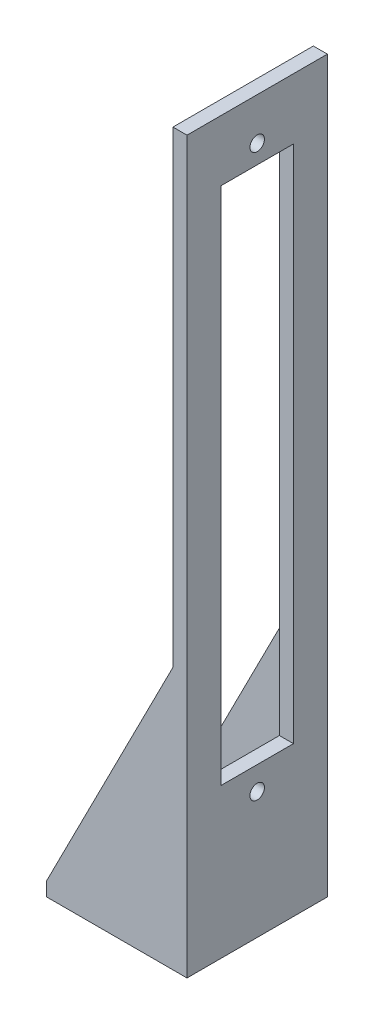
ISO-10303-21;
HEADER;
FILE_DESCRIPTION(('STEP AP214'),'2;1');
FILE_NAME('part.step','',(''),(''),'','','');
FILE_SCHEMA(('AUTOMOTIVE_DESIGN { 1 0 10303 214 1 1 1 1 }'));
ENDSEC;
DATA;
#1=APPLICATION_CONTEXT('core data for automotive mechanical design processes');
#2=APPLICATION_PROTOCOL_DEFINITION('international standard','automotive_design',2000,#1);
#3=PRODUCT_CONTEXT('',#1,'mechanical');
#4=PRODUCT('Part','Part','',(#3));
#5=PRODUCT_RELATED_PRODUCT_CATEGORY('part','',(#4));
#6=PRODUCT_DEFINITION_FORMATION('','',#4);
#7=PRODUCT_DEFINITION_CONTEXT('part definition',#1,'design');
#8=PRODUCT_DEFINITION('design','',#6,#7);
#9=PRODUCT_DEFINITION_SHAPE('','',#8);
#10=(LENGTH_UNIT() NAMED_UNIT(*) SI_UNIT(.MILLI.,.METRE.));
#11=(NAMED_UNIT(*) PLANE_ANGLE_UNIT() SI_UNIT($,.RADIAN.));
#12=(NAMED_UNIT(*) SI_UNIT($,.STERADIAN.) SOLID_ANGLE_UNIT());
#13=UNCERTAINTY_MEASURE_WITH_UNIT(LENGTH_MEASURE(1.E-05),#10,'distance_accuracy_value','');
#14=(GEOMETRIC_REPRESENTATION_CONTEXT(3) GLOBAL_UNCERTAINTY_ASSIGNED_CONTEXT((#13)) GLOBAL_UNIT_ASSIGNED_CONTEXT((#10,
#11,#12)) REPRESENTATION_CONTEXT('',''));
#15=CARTESIAN_POINT('',(0.,0.,0.));
#16=DIRECTION('',(0.,0.,1.));
#17=DIRECTION('',(1.,0.,0.));
#18=AXIS2_PLACEMENT_3D('',#15,#16,#17);
#19=CARTESIAN_POINT('',(0.,3.,0.));
#20=DIRECTION('',(0.,-1.,0.));
#21=DIRECTION('',(0.,0.,-1.));
#22=AXIS2_PLACEMENT_3D('',#19,#20,#21);
#23=PLANE('',#22);
#24=CARTESIAN_POINT('',(7.,3.,-9.));
#25=DIRECTION('',(0.,1.,0.));
#26=DIRECTION('',(0.,0.,1.));
#27=AXIS2_PLACEMENT_3D('',#24,#25,#26);
#28=CIRCLE('',#27,1.55);
#29=CARTESIAN_POINT('',(7.,3.,-7.45));
#30=VERTEX_POINT('',#29);
#31=EDGE_CURVE('E239',#30,#30,#28,.T.);
#32=ORIENTED_EDGE('',*,*,#31,.F.);
#33=EDGE_LOOP('',(#32));
#34=FACE_BOUND('',#33,.T.);
#35=CARTESIAN_POINT('',(-9.,3.,7.));
#36=DIRECTION('',(0.,1.,0.));
#37=DIRECTION('',(0.,0.,1.));
#38=AXIS2_PLACEMENT_3D('',#35,#36,#37);
#39=CIRCLE('',#38,1.55);
#40=CARTESIAN_POINT('',(-9.,3.,8.55));
#41=VERTEX_POINT('',#40);
#42=EDGE_CURVE('E247',#41,#41,#39,.T.);
#43=ORIENTED_EDGE('',*,*,#42,.F.);
#44=EDGE_LOOP('',(#43));
#45=FACE_BOUND('',#44,.T.);
#46=DIRECTION('',(0.,0.,1.));
#47=VECTOR('',#46,1.);
#48=CARTESIAN_POINT('',(12.,3.,-15.));
#49=LINE('',#48,#47);
#50=CARTESIAN_POINT('',(12.,3.,-12.));
#51=VERTEX_POINT('',#50);
#52=CARTESIAN_POINT('',(12.,3.,12.));
#53=VERTEX_POINT('',#52);
#54=EDGE_CURVE('E167',#51,#53,#49,.T.);
#55=ORIENTED_EDGE('',*,*,#54,.F.);
#56=DIRECTION('',(-1.,0.,0.));
#57=VECTOR('',#56,1.);
#58=CARTESIAN_POINT('',(12.,3.,-12.));
#59=LINE('',#58,#57);
#60=CARTESIAN_POINT('',(-15.,3.,-12.));
#61=VERTEX_POINT('',#60);
#62=EDGE_CURVE('E63',#51,#61,#59,.T.);
#63=ORIENTED_EDGE('',*,*,#62,.T.);
#64=DIRECTION('',(0.,0.,1.));
#65=VECTOR('',#64,1.);
#66=CARTESIAN_POINT('',(-15.,3.,15.));
#67=LINE('',#66,#65);
#68=CARTESIAN_POINT('',(-15.,3.,12.));
#69=VERTEX_POINT('',#68);
#70=EDGE_CURVE('E260',#61,#69,#67,.T.);
#71=ORIENTED_EDGE('',*,*,#70,.T.);
#72=DIRECTION('',(1.,0.,0.));
#73=VECTOR('',#72,1.);
#74=CARTESIAN_POINT('',(-15.,3.,12.));
#75=LINE('',#74,#73);
#76=EDGE_CURVE('E156',#69,#53,#75,.T.);
#77=ORIENTED_EDGE('',*,*,#76,.T.);
#78=EDGE_LOOP('',(#55,#63,#71,#77));
#79=FACE_BOUND('',#78,.T.);
#80=ADVANCED_FACE('F45',(#34,#45,#79),#23,.F.);
#81=CARTESIAN_POINT('',(0.,0.,0.));
#82=DIRECTION('',(0.,-1.,0.));
#83=DIRECTION('',(0.,0.,-1.));
#84=AXIS2_PLACEMENT_3D('',#81,#82,#83);
#85=PLANE('',#84);
#86=CARTESIAN_POINT('',(-9.,0.,7.));
#87=DIRECTION('',(0.,1.,0.));
#88=DIRECTION('',(0.,0.,1.));
#89=AXIS2_PLACEMENT_3D('',#86,#87,#88);
#90=CIRCLE('',#89,1.55);
#91=CARTESIAN_POINT('',(-9.,0.,8.55));
#92=VERTEX_POINT('',#91);
#93=EDGE_CURVE('E243',#92,#92,#90,.T.);
#94=ORIENTED_EDGE('',*,*,#93,.T.);
#95=EDGE_LOOP('',(#94));
#96=FACE_BOUND('',#95,.T.);
#97=DIRECTION('',(0.,0.,-1.));
#98=VECTOR('',#97,1.);
#99=CARTESIAN_POINT('',(15.,0.,15.));
#100=LINE('',#99,#98);
#101=CARTESIAN_POINT('',(15.,0.,15.));
#102=VERTEX_POINT('',#101);
#103=CARTESIAN_POINT('',(15.,0.,-15.));
#104=VERTEX_POINT('',#103);
#105=EDGE_CURVE('E251',#102,#104,#100,.T.);
#106=ORIENTED_EDGE('',*,*,#105,.F.);
#107=DIRECTION('',(1.,0.,0.));
#108=VECTOR('',#107,1.);
#109=CARTESIAN_POINT('',(-15.,0.,15.));
#110=LINE('',#109,#108);
#111=CARTESIAN_POINT('',(-15.,0.,15.));
#112=VERTEX_POINT('',#111);
#113=EDGE_CURVE('E270',#112,#102,#110,.T.);
#114=ORIENTED_EDGE('',*,*,#113,.F.);
#115=DIRECTION('',(0.,0.,1.));
#116=VECTOR('',#115,1.);
#117=CARTESIAN_POINT('',(-15.,0.,15.));
#118=LINE('',#117,#116);
#119=CARTESIAN_POINT('',(-15.,0.,-15.));
#120=VERTEX_POINT('',#119);
#121=EDGE_CURVE('E267',#120,#112,#118,.T.);
#122=ORIENTED_EDGE('',*,*,#121,.F.);
#123=DIRECTION('',(-1.,0.,0.));
#124=VECTOR('',#123,1.);
#125=CARTESIAN_POINT('',(-15.,0.,-15.));
#126=LINE('',#125,#124);
#127=EDGE_CURVE('E264',#104,#120,#126,.T.);
#128=ORIENTED_EDGE('',*,*,#127,.F.);
#129=EDGE_LOOP('',(#106,#114,#122,#128));
#130=FACE_BOUND('',#129,.T.);
#131=CARTESIAN_POINT('',(7.,0.,-9.));
#132=DIRECTION('',(0.,1.,0.));
#133=DIRECTION('',(0.,0.,1.));
#134=AXIS2_PLACEMENT_3D('',#131,#132,#133);
#135=CIRCLE('',#134,1.55);
#136=CARTESIAN_POINT('',(7.,0.,-7.45));
#137=VERTEX_POINT('',#136);
#138=EDGE_CURVE('E238',#137,#137,#135,.T.);
#139=ORIENTED_EDGE('',*,*,#138,.T.);
#140=EDGE_LOOP('',(#139));
#141=FACE_BOUND('',#140,.T.);
#142=ADVANCED_FACE('F322',(#96,#130,#141),#85,.T.);
#143=CARTESIAN_POINT('',(15.,3.,15.));
#144=DIRECTION('',(-1.,0.,0.));
#145=DIRECTION('',(0.,0.,1.));
#146=AXIS2_PLACEMENT_3D('',#143,#144,#145);
#147=PLANE('',#146);
#148=CARTESIAN_POINT('',(15.,147.,0.));
#149=DIRECTION('',(1.,0.,0.));
#150=DIRECTION('',(0.,0.,-1.));
#151=AXIS2_PLACEMENT_3D('',#148,#149,#150);
#152=CIRCLE('',#151,1.54999999999999);
#153=CARTESIAN_POINT('',(15.,147.,-1.54999999999999));
#154=VERTEX_POINT('',#153);
#155=EDGE_CURVE('E180',#154,#154,#152,.T.);
#156=ORIENTED_EDGE('',*,*,#155,.F.);
#157=EDGE_LOOP('',(#156));
#158=FACE_BOUND('',#157,.T.);
#159=CARTESIAN_POINT('',(15.,27.,0.));
#160=DIRECTION('',(1.,0.,0.));
#161=DIRECTION('',(0.,0.,-1.));
#162=AXIS2_PLACEMENT_3D('',#159,#160,#161);
#163=CIRCLE('',#162,1.55);
#164=CARTESIAN_POINT('',(15.,27.,-1.55));
#165=VERTEX_POINT('',#164);
#166=EDGE_CURVE('E185',#165,#165,#163,.T.);
#167=ORIENTED_EDGE('',*,*,#166,.F.);
#168=EDGE_LOOP('',(#167));
#169=FACE_BOUND('',#168,.T.);
#170=DIRECTION('',(0.,0.,1.));
#171=VECTOR('',#170,1.);
#172=CARTESIAN_POINT('',(15.,143.,7.75));
#173=LINE('',#172,#171);
#174=CARTESIAN_POINT('',(15.,143.,-7.75));
#175=VERTEX_POINT('',#174);
#176=CARTESIAN_POINT('',(15.,143.,7.75));
#177=VERTEX_POINT('',#176);
#178=EDGE_CURVE('E210',#175,#177,#173,.T.);
#179=ORIENTED_EDGE('',*,*,#178,.F.);
#180=DIRECTION('',(0.,1.,0.));
#181=VECTOR('',#180,1.);
#182=CARTESIAN_POINT('',(15.,32.,-7.75));
#183=LINE('',#182,#181);
#184=CARTESIAN_POINT('',(15.,32.,-7.75));
#185=VERTEX_POINT('',#184);
#186=EDGE_CURVE('E189',#185,#175,#183,.T.);
#187=ORIENTED_EDGE('',*,*,#186,.F.);
#188=DIRECTION('',(0.,0.,-1.));
#189=VECTOR('',#188,1.);
#190=CARTESIAN_POINT('',(15.,32.,7.75));
#191=LINE('',#190,#189);
#192=CARTESIAN_POINT('',(15.,32.,7.75));
#193=VERTEX_POINT('',#192);
#194=EDGE_CURVE('E194',#193,#185,#191,.T.);
#195=ORIENTED_EDGE('',*,*,#194,.F.);
#196=DIRECTION('',(0.,-1.,0.));
#197=VECTOR('',#196,1.);
#198=CARTESIAN_POINT('',(15.,32.,7.75));
#199=LINE('',#198,#197);
#200=EDGE_CURVE('E206',#177,#193,#199,.T.);
#201=ORIENTED_EDGE('',*,*,#200,.F.);
#202=EDGE_LOOP('',(#179,#187,#195,#201));
#203=FACE_BOUND('',#202,.T.);
#204=ORIENTED_EDGE('',*,*,#105,.T.);
#205=DIRECTION('',(0.,-1.,0.));
#206=VECTOR('',#205,1.);
#207=CARTESIAN_POINT('',(15.,3.,-15.));
#208=LINE('',#207,#206);
#209=CARTESIAN_POINT('',(15.,156.,-15.));
#210=VERTEX_POINT('',#209);
#211=EDGE_CURVE('E284',#210,#104,#208,.T.);
#212=ORIENTED_EDGE('',*,*,#211,.F.);
#213=DIRECTION('',(0.,0.,-1.));
#214=VECTOR('',#213,1.);
#215=CARTESIAN_POINT('',(15.,156.,-15.));
#216=LINE('',#215,#214);
#217=CARTESIAN_POINT('',(15.,156.,15.));
#218=VERTEX_POINT('',#217);
#219=EDGE_CURVE('E216',#218,#210,#216,.T.);
#220=ORIENTED_EDGE('',*,*,#219,.F.);
#221=DIRECTION('',(0.,-1.,0.));
#222=VECTOR('',#221,1.);
#223=CARTESIAN_POINT('',(15.,3.,15.));
#224=LINE('',#223,#222);
#225=EDGE_CURVE('E259',#218,#102,#224,.T.);
#226=ORIENTED_EDGE('',*,*,#225,.T.);
#227=EDGE_LOOP('',(#204,#212,#220,#226));
#228=FACE_BOUND('',#227,.T.);
#229=ADVANCED_FACE('F47',(#158,#169,#203,#228),#147,.F.);
#230=CARTESIAN_POINT('',(-15.,3.,-15.));
#231=DIRECTION('',(0.,0.,1.));
#232=DIRECTION('',(1.,0.,0.));
#233=AXIS2_PLACEMENT_3D('',#230,#231,#232);
#234=PLANE('',#233);
#235=DIRECTION('',(0.,-1.,0.));
#236=VECTOR('',#235,1.);
#237=CARTESIAN_POINT('',(-15.,3.,-15.));
#238=LINE('',#237,#236);
#239=CARTESIAN_POINT('',(-15.,3.,-15.));
#240=VERTEX_POINT('',#239);
#241=EDGE_CURVE('E280',#240,#120,#238,.T.);
#242=ORIENTED_EDGE('',*,*,#241,.F.);
#243=DIRECTION('',(0.453925781418884,0.89103949685929,0.));
#244=VECTOR('',#243,1.);
#245=CARTESIAN_POINT('',(-15.,3.,-15.));
#246=LINE('',#245,#244);
#247=CARTESIAN_POINT('',(12.,56.,-15.));
#248=VERTEX_POINT('',#247);
#249=EDGE_CURVE('E354',#240,#248,#246,.T.);
#250=ORIENTED_EDGE('',*,*,#249,.T.);
#251=DIRECTION('',(0.,-1.,0.));
#252=VECTOR('',#251,1.);
#253=CARTESIAN_POINT('',(12.,156.,-15.));
#254=LINE('',#253,#252);
#255=CARTESIAN_POINT('',(12.,156.,-15.));
#256=VERTEX_POINT('',#255);
#257=EDGE_CURVE('E235',#256,#248,#254,.T.);
#258=ORIENTED_EDGE('',*,*,#257,.F.);
#259=DIRECTION('',(-1.,0.,0.));
#260=VECTOR('',#259,1.);
#261=CARTESIAN_POINT('',(15.,156.,-15.));
#262=LINE('',#261,#260);
#263=EDGE_CURVE('E220',#210,#256,#262,.T.);
#264=ORIENTED_EDGE('',*,*,#263,.F.);
#265=ORIENTED_EDGE('',*,*,#211,.T.);
#266=ORIENTED_EDGE('',*,*,#127,.T.);
#267=EDGE_LOOP('',(#242,#250,#258,#264,#265,#266));
#268=FACE_BOUND('',#267,.T.);
#269=ADVANCED_FACE('F343',(#268),#234,.F.);
#270=CARTESIAN_POINT('',(-15.,3.,15.));
#271=DIRECTION('',(1.,0.,0.));
#272=DIRECTION('',(0.,0.,-1.));
#273=AXIS2_PLACEMENT_3D('',#270,#271,#272);
#274=PLANE('',#273);
#275=ORIENTED_EDGE('',*,*,#121,.T.);
#276=DIRECTION('',(0.,-1.,0.));
#277=VECTOR('',#276,1.);
#278=CARTESIAN_POINT('',(-15.,3.,15.));
#279=LINE('',#278,#277);
#280=CARTESIAN_POINT('',(-15.,3.,15.));
#281=VERTEX_POINT('',#280);
#282=EDGE_CURVE('E276',#281,#112,#279,.T.);
#283=ORIENTED_EDGE('',*,*,#282,.F.);
#284=DIRECTION('',(0.,0.,1.));
#285=VECTOR('',#284,1.);
#286=CARTESIAN_POINT('',(-15.,3.,12.));
#287=LINE('',#286,#285);
#288=EDGE_CURVE('E155',#69,#281,#287,.T.);
#289=ORIENTED_EDGE('',*,*,#288,.F.);
#290=ORIENTED_EDGE('',*,*,#70,.F.);
#291=EDGE_CURVE('E255',#240,#61,#67,.T.);
#292=ORIENTED_EDGE('',*,*,#291,.F.);
#293=ORIENTED_EDGE('',*,*,#241,.T.);
#294=EDGE_LOOP('',(#275,#283,#289,#290,#292,#293));
#295=FACE_BOUND('',#294,.T.);
#296=ADVANCED_FACE('F340',(#295),#274,.F.);
#297=CARTESIAN_POINT('',(-15.,3.,15.));
#298=DIRECTION('',(0.,0.,-1.));
#299=DIRECTION('',(-1.,0.,0.));
#300=AXIS2_PLACEMENT_3D('',#297,#298,#299);
#301=PLANE('',#300);
#302=ORIENTED_EDGE('',*,*,#113,.T.);
#303=ORIENTED_EDGE('',*,*,#225,.F.);
#304=DIRECTION('',(1.,0.,0.));
#305=VECTOR('',#304,1.);
#306=CARTESIAN_POINT('',(15.,156.,15.));
#307=LINE('',#306,#305);
#308=CARTESIAN_POINT('',(12.,156.,15.));
#309=VERTEX_POINT('',#308);
#310=EDGE_CURVE('E226',#309,#218,#307,.T.);
#311=ORIENTED_EDGE('',*,*,#310,.F.);
#312=DIRECTION('',(0.,-1.,0.));
#313=VECTOR('',#312,1.);
#314=CARTESIAN_POINT('',(12.,156.,15.));
#315=LINE('',#314,#313);
#316=CARTESIAN_POINT('',(12.,56.,15.));
#317=VERTEX_POINT('',#316);
#318=EDGE_CURVE('E230',#309,#317,#315,.T.);
#319=ORIENTED_EDGE('',*,*,#318,.T.);
#320=DIRECTION('',(-0.453925781418884,-0.89103949685929,0.));
#321=VECTOR('',#320,1.);
#322=CARTESIAN_POINT('',(12.,56.,15.));
#323=LINE('',#322,#321);
#324=EDGE_CURVE('E150',#317,#281,#323,.T.);
#325=ORIENTED_EDGE('',*,*,#324,.T.);
#326=ORIENTED_EDGE('',*,*,#282,.T.);
#327=EDGE_LOOP('',(#302,#303,#311,#319,#325,#326));
#328=FACE_BOUND('',#327,.T.);
#329=ADVANCED_FACE('F338',(#328),#301,.F.);
#330=CARTESIAN_POINT('',(-9.,3.,7.));
#331=DIRECTION('',(0.,-1.,0.));
#332=DIRECTION('',(0.,0.,-1.));
#333=AXIS2_PLACEMENT_3D('',#330,#331,#332);
#334=CYLINDRICAL_SURFACE('',#333,1.55);
#335=ORIENTED_EDGE('',*,*,#42,.T.);
#336=EDGE_LOOP('',(#335));
#337=FACE_BOUND('',#336,.T.);
#338=ORIENTED_EDGE('',*,*,#93,.F.);
#339=EDGE_LOOP('',(#338));
#340=FACE_BOUND('',#339,.T.);
#341=ADVANCED_FACE('F335',(#337,#340),#334,.F.);
#342=CARTESIAN_POINT('',(7.,3.,-9.));
#343=DIRECTION('',(0.,-1.,0.));
#344=DIRECTION('',(0.,0.,-1.));
#345=AXIS2_PLACEMENT_3D('',#342,#343,#344);
#346=CYLINDRICAL_SURFACE('',#345,1.55);
#347=ORIENTED_EDGE('',*,*,#31,.T.);
#348=EDGE_LOOP('',(#347));
#349=FACE_BOUND('',#348,.T.);
#350=ORIENTED_EDGE('',*,*,#138,.F.);
#351=EDGE_LOOP('',(#350));
#352=FACE_BOUND('',#351,.T.);
#353=ADVANCED_FACE('F463',(#349,#352),#346,.F.);
#354=CARTESIAN_POINT('',(12.,156.,-15.));
#355=DIRECTION('',(1.,0.,0.));
#356=DIRECTION('',(0.,0.,-1.));
#357=AXIS2_PLACEMENT_3D('',#354,#355,#356);
#358=PLANE('',#357);
#359=CARTESIAN_POINT('',(12.,147.,0.));
#360=DIRECTION('',(1.,0.,0.));
#361=DIRECTION('',(0.,0.,-1.));
#362=AXIS2_PLACEMENT_3D('',#359,#360,#361);
#363=CIRCLE('',#362,1.54999999999999);
#364=CARTESIAN_POINT('',(12.,147.,-1.54999999999999));
#365=VERTEX_POINT('',#364);
#366=EDGE_CURVE('E49',#365,#365,#363,.T.);
#367=ORIENTED_EDGE('',*,*,#366,.T.);
#368=EDGE_LOOP('',(#367));
#369=FACE_BOUND('',#368,.T.);
#370=CARTESIAN_POINT('',(12.,27.,0.));
#371=DIRECTION('',(1.,0.,0.));
#372=DIRECTION('',(0.,0.,-1.));
#373=AXIS2_PLACEMENT_3D('',#370,#371,#372);
#374=CIRCLE('',#373,1.55);
#375=CARTESIAN_POINT('',(12.,27.,-1.55));
#376=VERTEX_POINT('',#375);
#377=EDGE_CURVE('E184',#376,#376,#374,.T.);
#378=ORIENTED_EDGE('',*,*,#377,.T.);
#379=EDGE_LOOP('',(#378));
#380=FACE_BOUND('',#379,.T.);
#381=DIRECTION('',(0.,0.,-1.));
#382=VECTOR('',#381,1.);
#383=CARTESIAN_POINT('',(12.,32.,-15.));
#384=LINE('',#383,#382);
#385=CARTESIAN_POINT('',(12.,32.,7.75));
#386=VERTEX_POINT('',#385);
#387=CARTESIAN_POINT('',(12.,32.,-7.75));
#388=VERTEX_POINT('',#387);
#389=EDGE_CURVE('E55',#386,#388,#384,.T.);
#390=ORIENTED_EDGE('',*,*,#389,.T.);
#391=DIRECTION('',(0.,1.,0.));
#392=VECTOR('',#391,1.);
#393=CARTESIAN_POINT('',(12.,156.,-7.75));
#394=LINE('',#393,#392);
#395=CARTESIAN_POINT('',(12.,143.,-7.75));
#396=VERTEX_POINT('',#395);
#397=EDGE_CURVE('E11',#388,#396,#394,.T.);
#398=ORIENTED_EDGE('',*,*,#397,.T.);
#399=DIRECTION('',(0.,0.,1.));
#400=VECTOR('',#399,1.);
#401=CARTESIAN_POINT('',(12.,143.,-15.));
#402=LINE('',#401,#400);
#403=CARTESIAN_POINT('',(12.,143.,7.75));
#404=VERTEX_POINT('',#403);
#405=EDGE_CURVE('E288',#396,#404,#402,.T.);
#406=ORIENTED_EDGE('',*,*,#405,.T.);
#407=DIRECTION('',(0.,-1.,0.));
#408=VECTOR('',#407,1.);
#409=CARTESIAN_POINT('',(12.,156.,7.75));
#410=LINE('',#409,#408);
#411=EDGE_CURVE('E292',#404,#386,#410,.T.);
#412=ORIENTED_EDGE('',*,*,#411,.T.);
#413=EDGE_LOOP('',(#390,#398,#406,#412));
#414=FACE_BOUND('',#413,.T.);
#415=ORIENTED_EDGE('',*,*,#257,.T.);
#416=DIRECTION('',(0.,0.,-1.));
#417=VECTOR('',#416,1.);
#418=CARTESIAN_POINT('',(12.,56.,-12.));
#419=LINE('',#418,#417);
#420=CARTESIAN_POINT('',(12.,56.,-12.));
#421=VERTEX_POINT('',#420);
#422=EDGE_CURVE('E71',#421,#248,#419,.T.);
#423=ORIENTED_EDGE('',*,*,#422,.F.);
#424=DIRECTION('',(0.,-1.,0.));
#425=VECTOR('',#424,1.);
#426=CARTESIAN_POINT('',(12.,56.,-12.));
#427=LINE('',#426,#425);
#428=EDGE_CURVE('E364',#421,#51,#427,.T.);
#429=ORIENTED_EDGE('',*,*,#428,.T.);
#430=ORIENTED_EDGE('',*,*,#54,.T.);
#431=DIRECTION('',(0.,1.,0.));
#432=VECTOR('',#431,1.);
#433=CARTESIAN_POINT('',(12.,3.,12.));
#434=LINE('',#433,#432);
#435=CARTESIAN_POINT('',(12.,56.,12.));
#436=VERTEX_POINT('',#435);
#437=EDGE_CURVE('E161',#53,#436,#434,.T.);
#438=ORIENTED_EDGE('',*,*,#437,.T.);
#439=DIRECTION('',(0.,0.,1.));
#440=VECTOR('',#439,1.);
#441=CARTESIAN_POINT('',(12.,56.,12.));
#442=LINE('',#441,#440);
#443=EDGE_CURVE('E144',#436,#317,#442,.T.);
#444=ORIENTED_EDGE('',*,*,#443,.T.);
#445=ORIENTED_EDGE('',*,*,#318,.F.);
#446=DIRECTION('',(0.,0.,1.));
#447=VECTOR('',#446,1.);
#448=CARTESIAN_POINT('',(12.,156.,-15.));
#449=LINE('',#448,#447);
#450=EDGE_CURVE('E223',#256,#309,#449,.T.);
#451=ORIENTED_EDGE('',*,*,#450,.F.);
#452=EDGE_LOOP('',(#415,#423,#429,#430,#438,#444,#445,#451));
#453=FACE_BOUND('',#452,.T.);
#454=ADVANCED_FACE('F166',(#369,#380,#414,#453),#358,.F.);
#455=CARTESIAN_POINT('',(0.,156.,0.));
#456=DIRECTION('',(0.,-1.,0.));
#457=DIRECTION('',(0.,0.,-1.));
#458=AXIS2_PLACEMENT_3D('',#455,#456,#457);
#459=PLANE('',#458);
#460=ORIENTED_EDGE('',*,*,#219,.T.);
#461=ORIENTED_EDGE('',*,*,#263,.T.);
#462=ORIENTED_EDGE('',*,*,#450,.T.);
#463=ORIENTED_EDGE('',*,*,#310,.T.);
#464=EDGE_LOOP('',(#460,#461,#462,#463));
#465=FACE_BOUND('',#464,.T.);
#466=ADVANCED_FACE('F445',(#465),#459,.F.);
#467=CARTESIAN_POINT('',(-138.,32.,-7.75));
#468=DIRECTION('',(0.,0.,-1.));
#469=DIRECTION('',(-1.,0.,0.));
#470=AXIS2_PLACEMENT_3D('',#467,#468,#469);
#471=PLANE('',#470);
#472=DIRECTION('',(1.,0.,0.));
#473=VECTOR('',#472,1.);
#474=CARTESIAN_POINT('',(-138.,32.,-7.75));
#475=LINE('',#474,#473);
#476=EDGE_CURVE('E178',#388,#185,#475,.T.);
#477=ORIENTED_EDGE('',*,*,#476,.T.);
#478=ORIENTED_EDGE('',*,*,#186,.T.);
#479=DIRECTION('',(1.,0.,0.));
#480=VECTOR('',#479,1.);
#481=CARTESIAN_POINT('',(-138.,143.,-7.75));
#482=LINE('',#481,#480);
#483=EDGE_CURVE('E190',#396,#175,#482,.T.);
#484=ORIENTED_EDGE('',*,*,#483,.F.);
#485=ORIENTED_EDGE('',*,*,#397,.F.);
#486=EDGE_LOOP('',(#477,#478,#484,#485));
#487=FACE_BOUND('',#486,.T.);
#488=ADVANCED_FACE('F435',(#487),#471,.F.);
#489=CARTESIAN_POINT('',(-138.,32.,7.75));
#490=DIRECTION('',(0.,-1.,0.));
#491=DIRECTION('',(0.,0.,-1.));
#492=AXIS2_PLACEMENT_3D('',#489,#490,#491);
#493=PLANE('',#492);
#494=DIRECTION('',(1.,0.,0.));
#495=VECTOR('',#494,1.);
#496=CARTESIAN_POINT('',(-138.,32.,7.75));
#497=LINE('',#496,#495);
#498=EDGE_CURVE('E198',#386,#193,#497,.T.);
#499=ORIENTED_EDGE('',*,*,#498,.T.);
#500=ORIENTED_EDGE('',*,*,#194,.T.);
#501=ORIENTED_EDGE('',*,*,#476,.F.);
#502=ORIENTED_EDGE('',*,*,#389,.F.);
#503=EDGE_LOOP('',(#499,#500,#501,#502));
#504=FACE_BOUND('',#503,.T.);
#505=ADVANCED_FACE('F425',(#504),#493,.F.);
#506=CARTESIAN_POINT('',(-138.,32.,7.75));
#507=DIRECTION('',(0.,0.,1.));
#508=DIRECTION('',(1.,0.,0.));
#509=AXIS2_PLACEMENT_3D('',#506,#507,#508);
#510=PLANE('',#509);
#511=DIRECTION('',(1.,0.,0.));
#512=VECTOR('',#511,1.);
#513=CARTESIAN_POINT('',(-138.,143.,7.75));
#514=LINE('',#513,#512);
#515=EDGE_CURVE('E195',#404,#177,#514,.T.);
#516=ORIENTED_EDGE('',*,*,#515,.T.);
#517=ORIENTED_EDGE('',*,*,#200,.T.);
#518=ORIENTED_EDGE('',*,*,#498,.F.);
#519=ORIENTED_EDGE('',*,*,#411,.F.);
#520=EDGE_LOOP('',(#516,#517,#518,#519));
#521=FACE_BOUND('',#520,.T.);
#522=ADVANCED_FACE('F415',(#521),#510,.F.);
#523=CARTESIAN_POINT('',(-138.,143.,7.75));
#524=DIRECTION('',(0.,1.,0.));
#525=DIRECTION('',(0.,0.,1.));
#526=AXIS2_PLACEMENT_3D('',#523,#524,#525);
#527=PLANE('',#526);
#528=ORIENTED_EDGE('',*,*,#483,.T.);
#529=ORIENTED_EDGE('',*,*,#178,.T.);
#530=ORIENTED_EDGE('',*,*,#515,.F.);
#531=ORIENTED_EDGE('',*,*,#405,.F.);
#532=EDGE_LOOP('',(#528,#529,#530,#531));
#533=FACE_BOUND('',#532,.T.);
#534=ADVANCED_FACE('F318',(#533),#527,.F.);
#535=CARTESIAN_POINT('',(-138.,27.,0.));
#536=DIRECTION('',(1.,0.,0.));
#537=DIRECTION('',(0.,0.,-1.));
#538=AXIS2_PLACEMENT_3D('',#535,#536,#537);
#539=CYLINDRICAL_SURFACE('',#538,1.55);
#540=ORIENTED_EDGE('',*,*,#166,.T.);
#541=EDGE_LOOP('',(#540));
#542=FACE_BOUND('',#541,.T.);
#543=ORIENTED_EDGE('',*,*,#377,.F.);
#544=EDGE_LOOP('',(#543));
#545=FACE_BOUND('',#544,.T.);
#546=ADVANCED_FACE('F309',(#542,#545),#539,.F.);
#547=CARTESIAN_POINT('',(-138.,147.,0.));
#548=DIRECTION('',(1.,0.,0.));
#549=DIRECTION('',(0.,0.,-1.));
#550=AXIS2_PLACEMENT_3D('',#547,#548,#549);
#551=CYLINDRICAL_SURFACE('',#550,1.54999999999999);
#552=ORIENTED_EDGE('',*,*,#155,.T.);
#553=EDGE_LOOP('',(#552));
#554=FACE_BOUND('',#553,.T.);
#555=ORIENTED_EDGE('',*,*,#366,.F.);
#556=EDGE_LOOP('',(#555));
#557=FACE_BOUND('',#556,.T.);
#558=ADVANCED_FACE('F307',(#554,#557),#551,.F.);
#559=CARTESIAN_POINT('',(12.,56.,12.));
#560=DIRECTION('',(-0.89103949685929,0.453925781418884,0.));
#561=DIRECTION('',(-0.453925781418884,-0.89103949685929,0.));
#562=AXIS2_PLACEMENT_3D('',#559,#560,#561);
#563=PLANE('',#562);
#564=ORIENTED_EDGE('',*,*,#324,.F.);
#565=ORIENTED_EDGE('',*,*,#443,.F.);
#566=DIRECTION('',(-0.453925781418884,-0.89103949685929,0.));
#567=VECTOR('',#566,1.);
#568=CARTESIAN_POINT('',(12.,56.,12.));
#569=LINE('',#568,#567);
#570=EDGE_CURVE('E147',#436,#69,#569,.T.);
#571=ORIENTED_EDGE('',*,*,#570,.T.);
#572=ORIENTED_EDGE('',*,*,#288,.T.);
#573=EDGE_LOOP('',(#564,#565,#571,#572));
#574=FACE_BOUND('',#573,.T.);
#575=ADVANCED_FACE('F146',(#574),#563,.T.);
#576=CARTESIAN_POINT('',(0.,0.,12.));
#577=DIRECTION('',(0.,0.,-1.));
#578=DIRECTION('',(-1.,0.,0.));
#579=AXIS2_PLACEMENT_3D('',#576,#577,#578);
#580=PLANE('',#579);
#581=ORIENTED_EDGE('',*,*,#437,.F.);
#582=ORIENTED_EDGE('',*,*,#76,.F.);
#583=ORIENTED_EDGE('',*,*,#570,.F.);
#584=EDGE_LOOP('',(#581,#582,#583));
#585=FACE_BOUND('',#584,.T.);
#586=ADVANCED_FACE('F160',(#585),#580,.T.);
#587=CARTESIAN_POINT('',(-15.,3.,-12.));
#588=DIRECTION('',(-0.89103949685929,0.453925781418884,0.));
#589=DIRECTION('',(-0.453925781418884,-0.89103949685929,0.));
#590=AXIS2_PLACEMENT_3D('',#587,#588,#589);
#591=PLANE('',#590);
#592=ORIENTED_EDGE('',*,*,#249,.F.);
#593=ORIENTED_EDGE('',*,*,#291,.T.);
#594=DIRECTION('',(0.453925781418884,0.89103949685929,0.));
#595=VECTOR('',#594,1.);
#596=CARTESIAN_POINT('',(-15.,3.,-12.));
#597=LINE('',#596,#595);
#598=EDGE_CURVE('E361',#61,#421,#597,.T.);
#599=ORIENTED_EDGE('',*,*,#598,.T.);
#600=ORIENTED_EDGE('',*,*,#422,.T.);
#601=EDGE_LOOP('',(#592,#593,#599,#600));
#602=FACE_BOUND('',#601,.T.);
#603=ADVANCED_FACE('F358',(#602),#591,.T.);
#604=CARTESIAN_POINT('',(0.,0.,-12.));
#605=DIRECTION('',(0.,0.,1.));
#606=DIRECTION('',(1.,0.,0.));
#607=AXIS2_PLACEMENT_3D('',#604,#605,#606);
#608=PLANE('',#607);
#609=ORIENTED_EDGE('',*,*,#62,.F.);
#610=ORIENTED_EDGE('',*,*,#428,.F.);
#611=ORIENTED_EDGE('',*,*,#598,.F.);
#612=EDGE_LOOP('',(#609,#610,#611));
#613=FACE_BOUND('',#612,.T.);
#614=ADVANCED_FACE('F370',(#613),#608,.T.);
#615=CLOSED_SHELL('',(#80,#142,#229,#269,#296,#329,#341,#353,#454,#466,#488,#505,#522,#534,#546,
#558,#575,#586,#603,#614));
#616=MANIFOLD_SOLID_BREP('B2',#615);
#617=ADVANCED_BREP_SHAPE_REPRESENTATION('',(#18,#616),#14);
#618=SHAPE_DEFINITION_REPRESENTATION(#9,#617);
ENDSEC;
END-ISO-10303-21;
